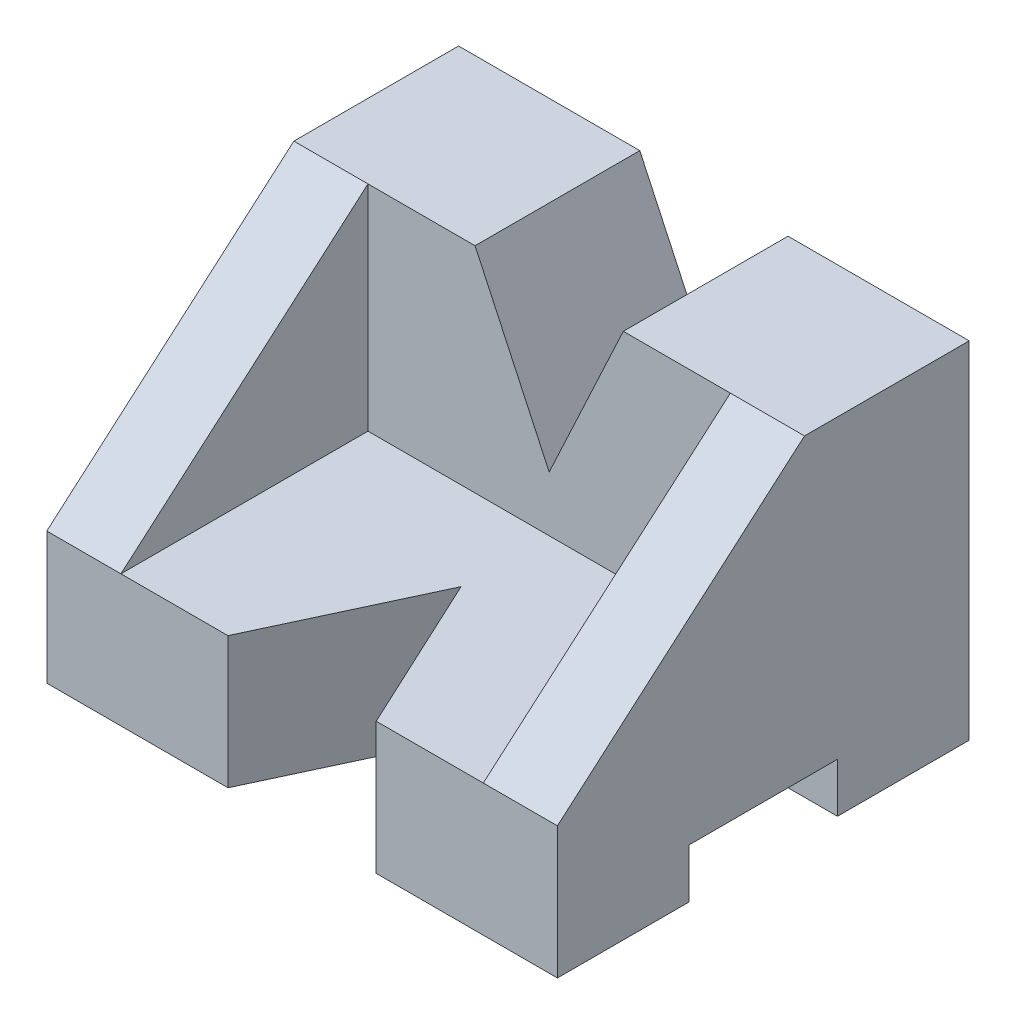
ISO-10303-21;
HEADER;
FILE_DESCRIPTION(('STEP AP214'),'2;1');
FILE_NAME('part.step','',(''),(''),'','','');
FILE_SCHEMA(('AUTOMOTIVE_DESIGN { 1 0 10303 214 1 1 1 1 }'));
ENDSEC;
DATA;
#1=APPLICATION_CONTEXT('core data for automotive mechanical design processes');
#2=APPLICATION_PROTOCOL_DEFINITION('international standard','automotive_design',2000,#1);
#3=PRODUCT_CONTEXT('',#1,'mechanical');
#4=PRODUCT('Part','Part','',(#3));
#5=PRODUCT_RELATED_PRODUCT_CATEGORY('part','',(#4));
#6=PRODUCT_DEFINITION_FORMATION('','',#4);
#7=PRODUCT_DEFINITION_CONTEXT('part definition',#1,'design');
#8=PRODUCT_DEFINITION('design','',#6,#7);
#9=PRODUCT_DEFINITION_SHAPE('','',#8);
#10=(LENGTH_UNIT() NAMED_UNIT(*) SI_UNIT(.MILLI.,.METRE.));
#11=(NAMED_UNIT(*) PLANE_ANGLE_UNIT() SI_UNIT($,.RADIAN.));
#12=(NAMED_UNIT(*) SI_UNIT($,.STERADIAN.) SOLID_ANGLE_UNIT());
#13=UNCERTAINTY_MEASURE_WITH_UNIT(LENGTH_MEASURE(1.E-05),#10,'distance_accuracy_value','');
#14=(GEOMETRIC_REPRESENTATION_CONTEXT(3) GLOBAL_UNCERTAINTY_ASSIGNED_CONTEXT((#13)) GLOBAL_UNIT_ASSIGNED_CONTEXT((#10,
#11,#12)) REPRESENTATION_CONTEXT('',''));
#15=CARTESIAN_POINT('',(0.,0.,0.));
#16=DIRECTION('',(0.,0.,1.));
#17=DIRECTION('',(1.,0.,0.));
#18=AXIS2_PLACEMENT_3D('',#15,#16,#17);
#19=CARTESIAN_POINT('',(31.,21.,-5.));
#20=DIRECTION('',(0.,-1.,0.));
#21=DIRECTION('',(0.,0.,-1.));
#22=AXIS2_PLACEMENT_3D('',#19,#20,#21);
#23=PLANE('',#22);
#24=DIRECTION('',(0.,0.,1.));
#25=VECTOR('',#24,1.);
#26=CARTESIAN_POINT('',(-9.,21.,-25.));
#27=LINE('',#26,#25);
#28=CARTESIAN_POINT('',(-9.,21.,-25.));
#29=VERTEX_POINT('',#28);
#30=CARTESIAN_POINT('',(-9.,21.,-5.));
#31=VERTEX_POINT('',#30);
#32=EDGE_CURVE('E52',#29,#31,#27,.T.);
#33=ORIENTED_EDGE('',*,*,#32,.F.);
#34=DIRECTION('',(-1.,0.,0.));
#35=VECTOR('',#34,1.);
#36=CARTESIAN_POINT('',(31.,21.,-25.));
#37=LINE('',#36,#35);
#38=CARTESIAN_POINT('',(-31.,21.,-25.));
#39=VERTEX_POINT('',#38);
#40=EDGE_CURVE('E183',#29,#39,#37,.T.);
#41=ORIENTED_EDGE('',*,*,#40,.T.);
#42=DIRECTION('',(0.,0.,1.));
#43=VECTOR('',#42,1.);
#44=CARTESIAN_POINT('',(-31.,21.,-5.));
#45=LINE('',#44,#43);
#46=CARTESIAN_POINT('',(-31.,21.,-5.));
#47=VERTEX_POINT('',#46);
#48=EDGE_CURVE('E305',#39,#47,#45,.T.);
#49=ORIENTED_EDGE('',*,*,#48,.T.);
#50=DIRECTION('',(1.,0.,0.));
#51=VECTOR('',#50,1.);
#52=CARTESIAN_POINT('',(-31.,21.,-5.));
#53=LINE('',#52,#51);
#54=CARTESIAN_POINT('',(-22.,21.,-5.));
#55=VERTEX_POINT('',#54);
#56=EDGE_CURVE('E274',#47,#55,#53,.T.);
#57=ORIENTED_EDGE('',*,*,#56,.T.);
#58=DIRECTION('',(-1.,0.,0.));
#59=VECTOR('',#58,1.);
#60=CARTESIAN_POINT('',(31.,21.,-5.));
#61=LINE('',#60,#59);
#62=EDGE_CURVE('E187',#31,#55,#61,.T.);
#63=ORIENTED_EDGE('',*,*,#62,.F.);
#64=EDGE_LOOP('',(#33,#41,#49,#57,#63));
#65=FACE_BOUND('',#64,.T.);
#66=ADVANCED_FACE('F36',(#65),#23,.F.);
#67=CARTESIAN_POINT('',(31.,-21.,25.));
#68=DIRECTION('',(0.,0.,-1.));
#69=DIRECTION('',(0.,1.,0.));
#70=AXIS2_PLACEMENT_3D('',#67,#68,#69);
#71=PLANE('',#70);
#72=DIRECTION('',(0.,1.,0.));
#73=VECTOR('',#72,1.);
#74=CARTESIAN_POINT('',(9.,-21.,25.));
#75=LINE('',#74,#73);
#76=CARTESIAN_POINT('',(9.,-21.,25.));
#77=VERTEX_POINT('',#76);
#78=CARTESIAN_POINT('',(9.,-5.00000000000001,25.));
#79=VERTEX_POINT('',#78);
#80=EDGE_CURVE('E251',#77,#79,#75,.T.);
#81=ORIENTED_EDGE('',*,*,#80,.F.);
#82=DIRECTION('',(-1.,0.,0.));
#83=VECTOR('',#82,1.);
#84=CARTESIAN_POINT('',(31.,-21.,25.));
#85=LINE('',#84,#83);
#86=CARTESIAN_POINT('',(31.,-21.,25.));
#87=VERTEX_POINT('',#86);
#88=EDGE_CURVE('E222',#87,#77,#85,.T.);
#89=ORIENTED_EDGE('',*,*,#88,.F.);
#90=DIRECTION('',(0.,-1.,0.));
#91=VECTOR('',#90,1.);
#92=CARTESIAN_POINT('',(31.,-21.,25.));
#93=LINE('',#92,#91);
#94=CARTESIAN_POINT('',(31.,-5.00000000000001,25.));
#95=VERTEX_POINT('',#94);
#96=EDGE_CURVE('E298',#95,#87,#93,.T.);
#97=ORIENTED_EDGE('',*,*,#96,.F.);
#98=DIRECTION('',(-1.,0.,0.));
#99=VECTOR('',#98,1.);
#100=CARTESIAN_POINT('',(31.,-5.00000000000001,25.));
#101=LINE('',#100,#99);
#102=CARTESIAN_POINT('',(22.,-5.00000000000001,25.));
#103=VERTEX_POINT('',#102);
#104=EDGE_CURVE('E223',#95,#103,#101,.T.);
#105=ORIENTED_EDGE('',*,*,#104,.T.);
#106=EDGE_CURVE('E228',#103,#79,#101,.T.);
#107=ORIENTED_EDGE('',*,*,#106,.T.);
#108=EDGE_LOOP('',(#81,#89,#97,#105,#107));
#109=FACE_BOUND('',#108,.T.);
#110=ADVANCED_FACE('F392',(#109),#71,.F.);
#111=CARTESIAN_POINT('',(31.,-21.,9.));
#112=DIRECTION('',(0.,1.,0.));
#113=DIRECTION('',(0.,0.,1.));
#114=AXIS2_PLACEMENT_3D('',#111,#112,#113);
#115=PLANE('',#114);
#116=DIRECTION('',(-1.,0.,0.));
#117=VECTOR('',#116,1.);
#118=CARTESIAN_POINT('',(31.,-21.,9.));
#119=LINE('',#118,#117);
#120=CARTESIAN_POINT('',(-1.53907746951993,-21.,9.));
#121=VERTEX_POINT('',#120);
#122=CARTESIAN_POINT('',(-31.,-21.,9.));
#123=VERTEX_POINT('',#122);
#124=EDGE_CURVE('E216',#121,#123,#119,.T.);
#125=ORIENTED_EDGE('',*,*,#124,.F.);
#126=DIRECTION('',(-0.422618261740704,0.,0.906307787036648));
#127=VECTOR('',#126,1.);
#128=CARTESIAN_POINT('',(-9.,-21.,25.));
#129=LINE('',#128,#127);
#130=CARTESIAN_POINT('',(-9.,-21.,25.));
#131=VERTEX_POINT('',#130);
#132=EDGE_CURVE('E248',#121,#131,#129,.T.);
#133=ORIENTED_EDGE('',*,*,#132,.T.);
#134=CARTESIAN_POINT('',(-31.,-21.,25.));
#135=VERTEX_POINT('',#134);
#136=EDGE_CURVE('E219',#131,#135,#85,.T.);
#137=ORIENTED_EDGE('',*,*,#136,.T.);
#138=DIRECTION('',(0.,0.,-1.));
#139=VECTOR('',#138,1.);
#140=CARTESIAN_POINT('',(-31.,-21.,9.));
#141=LINE('',#140,#139);
#142=EDGE_CURVE('E317',#135,#123,#141,.T.);
#143=ORIENTED_EDGE('',*,*,#142,.T.);
#144=EDGE_LOOP('',(#125,#133,#137,#143));
#145=FACE_BOUND('',#144,.T.);
#146=ADVANCED_FACE('F389',(#145),#115,.F.);
#147=CARTESIAN_POINT('',(31.,-15.,9.));
#148=DIRECTION('',(0.,0.,1.));
#149=DIRECTION('',(1.,0.,0.));
#150=AXIS2_PLACEMENT_3D('',#147,#148,#149);
#151=PLANE('',#150);
#152=DIRECTION('',(-1.,0.,0.));
#153=VECTOR('',#152,1.);
#154=CARTESIAN_POINT('',(31.,-15.,9.));
#155=LINE('',#154,#153);
#156=CARTESIAN_POINT('',(-1.53907746951993,-15.,9.));
#157=VERTEX_POINT('',#156);
#158=CARTESIAN_POINT('',(-31.,-15.,9.));
#159=VERTEX_POINT('',#158);
#160=EDGE_CURVE('E215',#157,#159,#155,.T.);
#161=ORIENTED_EDGE('',*,*,#160,.F.);
#162=DIRECTION('',(0.,-1.,0.));
#163=VECTOR('',#162,1.);
#164=CARTESIAN_POINT('',(-1.53907746951992,-15.,9.));
#165=LINE('',#164,#163);
#166=EDGE_CURVE('E264',#157,#121,#165,.T.);
#167=ORIENTED_EDGE('',*,*,#166,.T.);
#168=ORIENTED_EDGE('',*,*,#124,.T.);
#169=DIRECTION('',(0.,1.,0.));
#170=VECTOR('',#169,1.);
#171=CARTESIAN_POINT('',(-31.,-15.,9.));
#172=LINE('',#171,#170);
#173=EDGE_CURVE('E325',#123,#159,#172,.T.);
#174=ORIENTED_EDGE('',*,*,#173,.T.);
#175=EDGE_LOOP('',(#161,#167,#168,#174));
#176=FACE_BOUND('',#175,.T.);
#177=ADVANCED_FACE('F384',(#176),#151,.F.);
#178=CARTESIAN_POINT('',(31.,-5.00000000000001,-5.));
#179=DIRECTION('',(0.,0.,-1.));
#180=DIRECTION('',(-1.,0.,0.));
#181=AXIS2_PLACEMENT_3D('',#178,#179,#180);
#182=PLANE('',#181);
#183=CARTESIAN_POINT('',(22.,21.,-5.));
#184=VERTEX_POINT('',#183);
#185=CARTESIAN_POINT('',(9.,21.,-5.));
#186=VERTEX_POINT('',#185);
#187=EDGE_CURVE('E203',#184,#186,#61,.T.);
#188=ORIENTED_EDGE('',*,*,#187,.T.);
#189=DIRECTION('',(-0.422618261740704,-0.906307787036648,0.));
#190=VECTOR('',#189,1.);
#191=CARTESIAN_POINT('',(2.97075853290135,8.0702499483839,-5.));
#192=LINE('',#191,#190);
#193=CARTESIAN_POINT('',(0.,1.69943771541422,-5.));
#194=VERTEX_POINT('',#193);
#195=EDGE_CURVE('E11',#186,#194,#192,.T.);
#196=ORIENTED_EDGE('',*,*,#195,.T.);
#197=DIRECTION('',(-0.422618261740704,0.906307787036648,0.));
#198=VECTOR('',#197,1.);
#199=CARTESIAN_POINT('',(8.10282556681618,-15.6771277883046,-5.));
#200=LINE('',#199,#198);
#201=EDGE_CURVE('E46',#194,#31,#200,.T.);
#202=ORIENTED_EDGE('',*,*,#201,.T.);
#203=ORIENTED_EDGE('',*,*,#62,.T.);
#204=DIRECTION('',(0.,1.,0.));
#205=VECTOR('',#204,1.);
#206=CARTESIAN_POINT('',(-22.,-5.00000000000001,-5.));
#207=LINE('',#206,#205);
#208=CARTESIAN_POINT('',(-22.,-5.00000000000001,-5.));
#209=VERTEX_POINT('',#208);
#210=EDGE_CURVE('E271',#209,#55,#207,.T.);
#211=ORIENTED_EDGE('',*,*,#210,.F.);
#212=DIRECTION('',(-1.,0.,0.));
#213=VECTOR('',#212,1.);
#214=CARTESIAN_POINT('',(31.,-5.00000000000001,-5.));
#215=LINE('',#214,#213);
#216=CARTESIAN_POINT('',(22.,-5.00000000000001,-5.));
#217=VERTEX_POINT('',#216);
#218=EDGE_CURVE('E227',#217,#209,#215,.T.);
#219=ORIENTED_EDGE('',*,*,#218,.F.);
#220=DIRECTION('',(0.,1.,0.));
#221=VECTOR('',#220,1.);
#222=CARTESIAN_POINT('',(22.,-5.00000000000001,-5.));
#223=LINE('',#222,#221);
#224=EDGE_CURVE('E290',#217,#184,#223,.T.);
#225=ORIENTED_EDGE('',*,*,#224,.T.);
#226=EDGE_LOOP('',(#188,#196,#202,#203,#211,#219,#225));
#227=FACE_BOUND('',#226,.T.);
#228=ADVANCED_FACE('F37',(#227),#182,.F.);
#229=CARTESIAN_POINT('',(31.,-5.00000000000001,25.));
#230=DIRECTION('',(0.,-1.,0.));
#231=DIRECTION('',(0.,0.,-1.));
#232=AXIS2_PLACEMENT_3D('',#229,#230,#231);
#233=PLANE('',#232);
#234=CARTESIAN_POINT('',(-9.,-5.00000000000001,25.));
#235=VERTEX_POINT('',#234);
#236=CARTESIAN_POINT('',(-22.,-5.00000000000001,25.));
#237=VERTEX_POINT('',#236);
#238=EDGE_CURVE('E221',#235,#237,#101,.T.);
#239=ORIENTED_EDGE('',*,*,#238,.F.);
#240=DIRECTION('',(0.422618261740704,0.,-0.906307787036648));
#241=VECTOR('',#240,1.);
#242=CARTESIAN_POINT('',(-1.85575219373064,-5.00000000000001,9.67911113762032));
#243=LINE('',#242,#241);
#244=CARTESIAN_POINT('',(0.,-5.00000000000001,5.69943771541422));
#245=VERTEX_POINT('',#244);
#246=EDGE_CURVE('E268',#235,#245,#243,.T.);
#247=ORIENTED_EDGE('',*,*,#246,.T.);
#248=DIRECTION('',(0.422618261740704,0.,0.906307787036648));
#249=VECTOR('',#248,1.);
#250=CARTESIAN_POINT('',(12.9293362934482,-5.00000000000001,33.4264888743088));
#251=LINE('',#250,#249);
#252=EDGE_CURVE('E265',#245,#79,#251,.T.);
#253=ORIENTED_EDGE('',*,*,#252,.T.);
#254=ORIENTED_EDGE('',*,*,#106,.F.);
#255=DIRECTION('',(0.,0.,-1.));
#256=VECTOR('',#255,1.);
#257=CARTESIAN_POINT('',(22.,-5.00000000000001,25.));
#258=LINE('',#257,#256);
#259=EDGE_CURVE('E295',#103,#217,#258,.T.);
#260=ORIENTED_EDGE('',*,*,#259,.T.);
#261=ORIENTED_EDGE('',*,*,#218,.T.);
#262=DIRECTION('',(0.,0.,-1.));
#263=VECTOR('',#262,1.);
#264=CARTESIAN_POINT('',(-22.,-5.00000000000001,25.));
#265=LINE('',#264,#263);
#266=EDGE_CURVE('E277',#237,#209,#265,.T.);
#267=ORIENTED_EDGE('',*,*,#266,.F.);
#268=EDGE_LOOP('',(#239,#247,#253,#254,#260,#261,#267));
#269=FACE_BOUND('',#268,.T.);
#270=ADVANCED_FACE('F351',(#269),#233,.F.);
#271=ORIENTED_EDGE('',*,*,#136,.F.);
#272=DIRECTION('',(0.,1.,0.));
#273=VECTOR('',#272,1.);
#274=CARTESIAN_POINT('',(-9.,-21.,25.));
#275=LINE('',#274,#273);
#276=EDGE_CURVE('E255',#131,#235,#275,.T.);
#277=ORIENTED_EDGE('',*,*,#276,.T.);
#278=ORIENTED_EDGE('',*,*,#238,.T.);
#279=DIRECTION('',(1.,0.,0.));
#280=VECTOR('',#279,1.);
#281=CARTESIAN_POINT('',(-31.,-5.00000000000001,25.));
#282=LINE('',#281,#280);
#283=CARTESIAN_POINT('',(-31.,-5.00000000000001,25.));
#284=VERTEX_POINT('',#283);
#285=EDGE_CURVE('E283',#284,#237,#282,.T.);
#286=ORIENTED_EDGE('',*,*,#285,.F.);
#287=DIRECTION('',(0.,-1.,0.));
#288=VECTOR('',#287,1.);
#289=CARTESIAN_POINT('',(-31.,-21.,25.));
#290=LINE('',#289,#288);
#291=EDGE_CURVE('E292',#284,#135,#290,.T.);
#292=ORIENTED_EDGE('',*,*,#291,.T.);
#293=EDGE_LOOP('',(#271,#277,#278,#286,#292));
#294=FACE_BOUND('',#293,.T.);
#295=ADVANCED_FACE('F344',(#294),#71,.F.);
#296=ORIENTED_EDGE('',*,*,#88,.T.);
#297=DIRECTION('',(-0.422618261740704,0.,-0.906307787036648));
#298=VECTOR('',#297,1.);
#299=CARTESIAN_POINT('',(0.,-21.,5.69943771541422));
#300=LINE('',#299,#298);
#301=CARTESIAN_POINT('',(1.53907746951992,-21.,9.));
#302=VERTEX_POINT('',#301);
#303=EDGE_CURVE('E243',#77,#302,#300,.T.);
#304=ORIENTED_EDGE('',*,*,#303,.T.);
#305=CARTESIAN_POINT('',(31.,-21.,9.));
#306=VERTEX_POINT('',#305);
#307=EDGE_CURVE('E220',#306,#302,#119,.T.);
#308=ORIENTED_EDGE('',*,*,#307,.F.);
#309=DIRECTION('',(0.,0.,-1.));
#310=VECTOR('',#309,1.);
#311=CARTESIAN_POINT('',(31.,-21.,9.));
#312=LINE('',#311,#310);
#313=EDGE_CURVE('E302',#87,#306,#312,.T.);
#314=ORIENTED_EDGE('',*,*,#313,.F.);
#315=EDGE_LOOP('',(#296,#304,#308,#314));
#316=FACE_BOUND('',#315,.T.);
#317=ADVANCED_FACE('F402',(#316),#115,.F.);
#318=ORIENTED_EDGE('',*,*,#307,.T.);
#319=DIRECTION('',(0.,1.,0.));
#320=VECTOR('',#319,1.);
#321=CARTESIAN_POINT('',(1.53907746951993,-15.,9.));
#322=LINE('',#321,#320);
#323=CARTESIAN_POINT('',(1.53907746951992,-15.,9.));
#324=VERTEX_POINT('',#323);
#325=EDGE_CURVE('E260',#302,#324,#322,.T.);
#326=ORIENTED_EDGE('',*,*,#325,.T.);
#327=CARTESIAN_POINT('',(31.,-15.,9.));
#328=VERTEX_POINT('',#327);
#329=EDGE_CURVE('E213',#328,#324,#155,.T.);
#330=ORIENTED_EDGE('',*,*,#329,.F.);
#331=DIRECTION('',(0.,1.,0.));
#332=VECTOR('',#331,1.);
#333=CARTESIAN_POINT('',(31.,-15.,9.));
#334=LINE('',#333,#332);
#335=EDGE_CURVE('E301',#306,#328,#334,.T.);
#336=ORIENTED_EDGE('',*,*,#335,.F.);
#337=EDGE_LOOP('',(#318,#326,#330,#336));
#338=FACE_BOUND('',#337,.T.);
#339=ADVANCED_FACE('F401',(#338),#151,.F.);
#340=CARTESIAN_POINT('',(31.,-15.,-9.));
#341=DIRECTION('',(0.,1.,0.));
#342=DIRECTION('',(0.,0.,1.));
#343=AXIS2_PLACEMENT_3D('',#340,#341,#342);
#344=PLANE('',#343);
#345=DIRECTION('',(-0.422618261740704,0.,-0.906307787036648));
#346=VECTOR('',#345,1.);
#347=CARTESIAN_POINT('',(-0.0934192395745867,-15.,5.49909950963779));
#348=LINE('',#347,#346);
#349=CARTESIAN_POINT('',(0.,-15.,5.69943771541422));
#350=VERTEX_POINT('',#349);
#351=EDGE_CURVE('E232',#324,#350,#348,.T.);
#352=ORIENTED_EDGE('',*,*,#351,.T.);
#353=DIRECTION('',(-0.422618261740704,0.,0.906307787036648));
#354=VECTOR('',#353,1.);
#355=CARTESIAN_POINT('',(11.1670033392921,-15.,-18.2482782270507));
#356=LINE('',#355,#354);
#357=EDGE_CURVE('E231',#350,#157,#356,.T.);
#358=ORIENTED_EDGE('',*,*,#357,.T.);
#359=ORIENTED_EDGE('',*,*,#160,.T.);
#360=DIRECTION('',(0.,0.,-1.));
#361=VECTOR('',#360,1.);
#362=CARTESIAN_POINT('',(-31.,-15.,-9.));
#363=LINE('',#362,#361);
#364=CARTESIAN_POINT('',(-31.,-15.,-9.));
#365=VERTEX_POINT('',#364);
#366=EDGE_CURVE('E324',#159,#365,#363,.T.);
#367=ORIENTED_EDGE('',*,*,#366,.T.);
#368=DIRECTION('',(-1.,0.,0.));
#369=VECTOR('',#368,1.);
#370=CARTESIAN_POINT('',(31.,-15.,-9.));
#371=LINE('',#370,#369);
#372=CARTESIAN_POINT('',(31.,-15.,-9.));
#373=VERTEX_POINT('',#372);
#374=EDGE_CURVE('E207',#373,#365,#371,.T.);
#375=ORIENTED_EDGE('',*,*,#374,.F.);
#376=DIRECTION('',(0.,0.,-1.));
#377=VECTOR('',#376,1.);
#378=CARTESIAN_POINT('',(31.,-15.,-9.));
#379=LINE('',#378,#377);
#380=EDGE_CURVE('E308',#328,#373,#379,.T.);
#381=ORIENTED_EDGE('',*,*,#380,.F.);
#382=ORIENTED_EDGE('',*,*,#329,.T.);
#383=EDGE_LOOP('',(#352,#358,#359,#367,#375,#381,#382));
#384=FACE_BOUND('',#383,.T.);
#385=ADVANCED_FACE('F385',(#384),#344,.F.);
#386=CARTESIAN_POINT('',(31.,-21.,-9.));
#387=DIRECTION('',(0.,0.,-1.));
#388=DIRECTION('',(-1.,0.,0.));
#389=AXIS2_PLACEMENT_3D('',#386,#387,#388);
#390=PLANE('',#389);
#391=DIRECTION('',(0.,-1.,0.));
#392=VECTOR('',#391,1.);
#393=CARTESIAN_POINT('',(-31.,-21.,-9.));
#394=LINE('',#393,#392);
#395=CARTESIAN_POINT('',(-31.,-21.,-9.));
#396=VERTEX_POINT('',#395);
#397=EDGE_CURVE('E330',#365,#396,#394,.T.);
#398=ORIENTED_EDGE('',*,*,#397,.T.);
#399=DIRECTION('',(-1.,0.,0.));
#400=VECTOR('',#399,1.);
#401=CARTESIAN_POINT('',(31.,-21.,-9.));
#402=LINE('',#401,#400);
#403=CARTESIAN_POINT('',(31.,-21.,-9.));
#404=VERTEX_POINT('',#403);
#405=EDGE_CURVE('E206',#404,#396,#402,.T.);
#406=ORIENTED_EDGE('',*,*,#405,.F.);
#407=DIRECTION('',(0.,-1.,0.));
#408=VECTOR('',#407,1.);
#409=CARTESIAN_POINT('',(31.,-21.,-9.));
#410=LINE('',#409,#408);
#411=EDGE_CURVE('E306',#373,#404,#410,.T.);
#412=ORIENTED_EDGE('',*,*,#411,.F.);
#413=ORIENTED_EDGE('',*,*,#374,.T.);
#414=EDGE_LOOP('',(#398,#406,#412,#413));
#415=FACE_BOUND('',#414,.T.);
#416=ADVANCED_FACE('F378',(#415),#390,.F.);
#417=CARTESIAN_POINT('',(31.,-21.,-25.));
#418=DIRECTION('',(0.,1.,0.));
#419=DIRECTION('',(0.,0.,1.));
#420=AXIS2_PLACEMENT_3D('',#417,#418,#419);
#421=PLANE('',#420);
#422=DIRECTION('',(0.,0.,-1.));
#423=VECTOR('',#422,1.);
#424=CARTESIAN_POINT('',(-31.,-21.,-25.));
#425=LINE('',#424,#423);
#426=CARTESIAN_POINT('',(-31.,-21.,-25.));
#427=VERTEX_POINT('',#426);
#428=EDGE_CURVE('E328',#396,#427,#425,.T.);
#429=ORIENTED_EDGE('',*,*,#428,.T.);
#430=DIRECTION('',(-1.,0.,0.));
#431=VECTOR('',#430,1.);
#432=CARTESIAN_POINT('',(31.,-21.,-25.));
#433=LINE('',#432,#431);
#434=CARTESIAN_POINT('',(31.,-21.,-25.));
#435=VERTEX_POINT('',#434);
#436=EDGE_CURVE('E200',#435,#427,#433,.T.);
#437=ORIENTED_EDGE('',*,*,#436,.F.);
#438=DIRECTION('',(0.,0.,-1.));
#439=VECTOR('',#438,1.);
#440=CARTESIAN_POINT('',(31.,-21.,-25.));
#441=LINE('',#440,#439);
#442=EDGE_CURVE('E309',#404,#435,#441,.T.);
#443=ORIENTED_EDGE('',*,*,#442,.F.);
#444=ORIENTED_EDGE('',*,*,#405,.T.);
#445=EDGE_LOOP('',(#429,#437,#443,#444));
#446=FACE_BOUND('',#445,.T.);
#447=ADVANCED_FACE('F373',(#446),#421,.F.);
#448=CARTESIAN_POINT('',(31.,21.,-25.));
#449=DIRECTION('',(0.,0.,1.));
#450=DIRECTION('',(0.,-1.,0.));
#451=AXIS2_PLACEMENT_3D('',#448,#449,#450);
#452=PLANE('',#451);
#453=DIRECTION('',(0.422618261740704,-0.906307787036648,0.));
#454=VECTOR('',#453,1.);
#455=CARTESIAN_POINT('',(-9.,21.,-25.));
#456=LINE('',#455,#454);
#457=CARTESIAN_POINT('',(0.,1.69943771541422,-25.));
#458=VERTEX_POINT('',#457);
#459=EDGE_CURVE('E172',#29,#458,#456,.T.);
#460=ORIENTED_EDGE('',*,*,#459,.T.);
#461=DIRECTION('',(0.422618261740704,0.906307787036648,0.));
#462=VECTOR('',#461,1.);
#463=CARTESIAN_POINT('',(0.,1.69943771541422,-25.));
#464=LINE('',#463,#462);
#465=CARTESIAN_POINT('',(9.,21.,-25.));
#466=VERTEX_POINT('',#465);
#467=EDGE_CURVE('E182',#458,#466,#464,.T.);
#468=ORIENTED_EDGE('',*,*,#467,.T.);
#469=CARTESIAN_POINT('',(31.,21.,-25.));
#470=VERTEX_POINT('',#469);
#471=EDGE_CURVE('E193',#470,#466,#37,.T.);
#472=ORIENTED_EDGE('',*,*,#471,.F.);
#473=DIRECTION('',(0.,1.,0.));
#474=VECTOR('',#473,1.);
#475=CARTESIAN_POINT('',(31.,21.,-25.));
#476=LINE('',#475,#474);
#477=EDGE_CURVE('E315',#435,#470,#476,.T.);
#478=ORIENTED_EDGE('',*,*,#477,.F.);
#479=ORIENTED_EDGE('',*,*,#436,.T.);
#480=DIRECTION('',(0.,1.,0.));
#481=VECTOR('',#480,1.);
#482=CARTESIAN_POINT('',(-31.,21.,-25.));
#483=LINE('',#482,#481);
#484=EDGE_CURVE('E194',#427,#39,#483,.T.);
#485=ORIENTED_EDGE('',*,*,#484,.T.);
#486=ORIENTED_EDGE('',*,*,#40,.F.);
#487=EDGE_LOOP('',(#460,#468,#472,#478,#479,#485,#486));
#488=FACE_BOUND('',#487,.T.);
#489=ADVANCED_FACE('F189',(#488),#452,.F.);
#490=ORIENTED_EDGE('',*,*,#471,.T.);
#491=DIRECTION('',(0.,0.,1.));
#492=VECTOR('',#491,1.);
#493=CARTESIAN_POINT('',(9.,21.,-25.));
#494=LINE('',#493,#492);
#495=EDGE_CURVE('E245',#466,#186,#494,.T.);
#496=ORIENTED_EDGE('',*,*,#495,.T.);
#497=ORIENTED_EDGE('',*,*,#187,.F.);
#498=CARTESIAN_POINT('',(31.,21.,-5.));
#499=VERTEX_POINT('',#498);
#500=EDGE_CURVE('E198',#499,#184,#61,.T.);
#501=ORIENTED_EDGE('',*,*,#500,.F.);
#502=DIRECTION('',(0.,0.,1.));
#503=VECTOR('',#502,1.);
#504=CARTESIAN_POINT('',(31.,21.,-5.));
#505=LINE('',#504,#503);
#506=EDGE_CURVE('E314',#470,#499,#505,.T.);
#507=ORIENTED_EDGE('',*,*,#506,.F.);
#508=EDGE_LOOP('',(#490,#496,#497,#501,#507));
#509=FACE_BOUND('',#508,.T.);
#510=ADVANCED_FACE('F361',(#509),#23,.F.);
#511=CARTESIAN_POINT('',(31.,0.,0.));
#512=DIRECTION('',(-1.,0.,0.));
#513=DIRECTION('',(0.,0.,1.));
#514=AXIS2_PLACEMENT_3D('',#511,#512,#513);
#515=PLANE('',#514);
#516=ORIENTED_EDGE('',*,*,#506,.T.);
#517=DIRECTION('',(0.,-0.654930538417842,0.755689082789817));
#518=VECTOR('',#517,1.);
#519=CARTESIAN_POINT('',(31.,21.,-5.));
#520=LINE('',#519,#518);
#521=EDGE_CURVE('E286',#499,#95,#520,.T.);
#522=ORIENTED_EDGE('',*,*,#521,.T.);
#523=ORIENTED_EDGE('',*,*,#96,.T.);
#524=ORIENTED_EDGE('',*,*,#313,.T.);
#525=ORIENTED_EDGE('',*,*,#335,.T.);
#526=ORIENTED_EDGE('',*,*,#380,.T.);
#527=ORIENTED_EDGE('',*,*,#411,.T.);
#528=ORIENTED_EDGE('',*,*,#442,.T.);
#529=ORIENTED_EDGE('',*,*,#477,.T.);
#530=EDGE_LOOP('',(#516,#522,#523,#524,#525,#526,#527,#528,#529));
#531=FACE_BOUND('',#530,.T.);
#532=ADVANCED_FACE('F366',(#531),#515,.F.);
#533=CARTESIAN_POINT('',(-31.,0.,0.));
#534=DIRECTION('',(-1.,0.,0.));
#535=DIRECTION('',(0.,0.,1.));
#536=AXIS2_PLACEMENT_3D('',#533,#534,#535);
#537=PLANE('',#536);
#538=DIRECTION('',(0.,-0.654930538417842,0.755689082789817));
#539=VECTOR('',#538,1.);
#540=CARTESIAN_POINT('',(-31.,21.,-5.));
#541=LINE('',#540,#539);
#542=EDGE_CURVE('E275',#47,#284,#541,.T.);
#543=ORIENTED_EDGE('',*,*,#542,.F.);
#544=ORIENTED_EDGE('',*,*,#48,.F.);
#545=ORIENTED_EDGE('',*,*,#484,.F.);
#546=ORIENTED_EDGE('',*,*,#428,.F.);
#547=ORIENTED_EDGE('',*,*,#397,.F.);
#548=ORIENTED_EDGE('',*,*,#366,.F.);
#549=ORIENTED_EDGE('',*,*,#173,.F.);
#550=ORIENTED_EDGE('',*,*,#142,.F.);
#551=ORIENTED_EDGE('',*,*,#291,.F.);
#552=EDGE_LOOP('',(#543,#544,#545,#546,#547,#548,#549,#550,#551));
#553=FACE_BOUND('',#552,.T.);
#554=ADVANCED_FACE('F337',(#553),#537,.T.);
#555=CARTESIAN_POINT('',(31.,21.,-5.));
#556=DIRECTION('',(0.,-0.755689082789817,-0.654930538417842));
#557=DIRECTION('',(0.,0.654930538417842,-0.755689082789818));
#558=AXIS2_PLACEMENT_3D('',#555,#556,#557);
#559=PLANE('',#558);
#560=DIRECTION('',(0.,-0.654930538417842,0.755689082789817));
#561=VECTOR('',#560,1.);
#562=CARTESIAN_POINT('',(22.,21.,-5.));
#563=LINE('',#562,#561);
#564=EDGE_CURVE('E293',#184,#103,#563,.T.);
#565=ORIENTED_EDGE('',*,*,#564,.T.);
#566=ORIENTED_EDGE('',*,*,#104,.F.);
#567=ORIENTED_EDGE('',*,*,#521,.F.);
#568=ORIENTED_EDGE('',*,*,#500,.T.);
#569=EDGE_LOOP('',(#565,#566,#567,#568));
#570=FACE_BOUND('',#569,.T.);
#571=ADVANCED_FACE('F358',(#570),#559,.F.);
#572=CARTESIAN_POINT('',(22.,0.,0.));
#573=DIRECTION('',(-1.,0.,0.));
#574=DIRECTION('',(0.,0.,1.));
#575=AXIS2_PLACEMENT_3D('',#572,#573,#574);
#576=PLANE('',#575);
#577=ORIENTED_EDGE('',*,*,#224,.F.);
#578=ORIENTED_EDGE('',*,*,#259,.F.);
#579=ORIENTED_EDGE('',*,*,#564,.F.);
#580=EDGE_LOOP('',(#577,#578,#579));
#581=FACE_BOUND('',#580,.T.);
#582=ADVANCED_FACE('F357',(#581),#576,.T.);
#583=CARTESIAN_POINT('',(-31.,21.,-5.));
#584=DIRECTION('',(0.,0.755689082789817,0.654930538417842));
#585=DIRECTION('',(0.,-0.654930538417842,0.755689082789818));
#586=AXIS2_PLACEMENT_3D('',#583,#584,#585);
#587=PLANE('',#586);
#588=DIRECTION('',(0.,-0.654930538417842,0.755689082789817));
#589=VECTOR('',#588,1.);
#590=CARTESIAN_POINT('',(-22.,21.,-5.));
#591=LINE('',#590,#589);
#592=EDGE_CURVE('E276',#55,#237,#591,.T.);
#593=ORIENTED_EDGE('',*,*,#592,.F.);
#594=ORIENTED_EDGE('',*,*,#56,.F.);
#595=ORIENTED_EDGE('',*,*,#542,.T.);
#596=ORIENTED_EDGE('',*,*,#285,.T.);
#597=EDGE_LOOP('',(#593,#594,#595,#596));
#598=FACE_BOUND('',#597,.T.);
#599=ADVANCED_FACE('F336',(#598),#587,.T.);
#600=CARTESIAN_POINT('',(-22.,0.,0.));
#601=DIRECTION('',(-1.,0.,0.));
#602=DIRECTION('',(0.,0.,1.));
#603=AXIS2_PLACEMENT_3D('',#600,#601,#602);
#604=PLANE('',#603);
#605=ORIENTED_EDGE('',*,*,#210,.T.);
#606=ORIENTED_EDGE('',*,*,#592,.T.);
#607=ORIENTED_EDGE('',*,*,#266,.T.);
#608=EDGE_LOOP('',(#605,#606,#607));
#609=FACE_BOUND('',#608,.T.);
#610=ADVANCED_FACE('F350',(#609),#604,.F.);
#611=CARTESIAN_POINT('',(-9.,-21.,25.));
#612=DIRECTION('',(-0.906307787036648,0.,-0.422618261740704));
#613=DIRECTION('',(-0.422618261740704,0.,0.906307787036648));
#614=AXIS2_PLACEMENT_3D('',#611,#612,#613);
#615=PLANE('',#614);
#616=ORIENTED_EDGE('',*,*,#276,.F.);
#617=ORIENTED_EDGE('',*,*,#132,.F.);
#618=ORIENTED_EDGE('',*,*,#166,.F.);
#619=ORIENTED_EDGE('',*,*,#357,.F.);
#620=DIRECTION('',(0.,1.,0.));
#621=VECTOR('',#620,1.);
#622=CARTESIAN_POINT('',(0.,-21.,5.69943771541422));
#623=LINE('',#622,#621);
#624=EDGE_CURVE('E61',#350,#245,#623,.T.);
#625=ORIENTED_EDGE('',*,*,#624,.T.);
#626=ORIENTED_EDGE('',*,*,#246,.F.);
#627=EDGE_LOOP('',(#616,#617,#618,#619,#625,#626));
#628=FACE_BOUND('',#627,.T.);
#629=ADVANCED_FACE('F388',(#628),#615,.F.);
#630=CARTESIAN_POINT('',(0.,-21.,5.69943771541422));
#631=DIRECTION('',(0.906307787036648,0.,-0.422618261740704));
#632=DIRECTION('',(-0.422618261740704,0.,-0.906307787036648));
#633=AXIS2_PLACEMENT_3D('',#630,#631,#632);
#634=PLANE('',#633);
#635=ORIENTED_EDGE('',*,*,#624,.F.);
#636=ORIENTED_EDGE('',*,*,#351,.F.);
#637=ORIENTED_EDGE('',*,*,#325,.F.);
#638=ORIENTED_EDGE('',*,*,#303,.F.);
#639=ORIENTED_EDGE('',*,*,#80,.T.);
#640=ORIENTED_EDGE('',*,*,#252,.F.);
#641=EDGE_LOOP('',(#635,#636,#637,#638,#639,#640));
#642=FACE_BOUND('',#641,.T.);
#643=ADVANCED_FACE('F404',(#642),#634,.F.);
#644=CARTESIAN_POINT('',(0.,1.69943771541422,-25.));
#645=DIRECTION('',(0.906307787036648,-0.422618261740704,0.));
#646=DIRECTION('',(0.422618261740704,0.906307787036648,0.));
#647=AXIS2_PLACEMENT_3D('',#644,#645,#646);
#648=PLANE('',#647);
#649=ORIENTED_EDGE('',*,*,#495,.F.);
#650=ORIENTED_EDGE('',*,*,#467,.F.);
#651=DIRECTION('',(0.,0.,1.));
#652=VECTOR('',#651,1.);
#653=CARTESIAN_POINT('',(0.,1.69943771541422,-25.));
#654=LINE('',#653,#652);
#655=EDGE_CURVE('E177',#458,#194,#654,.T.);
#656=ORIENTED_EDGE('',*,*,#655,.T.);
#657=ORIENTED_EDGE('',*,*,#195,.F.);
#658=EDGE_LOOP('',(#649,#650,#656,#657));
#659=FACE_BOUND('',#658,.T.);
#660=ADVANCED_FACE('F238',(#659),#648,.F.);
#661=CARTESIAN_POINT('',(-9.,21.,-25.));
#662=DIRECTION('',(-0.906307787036648,-0.422618261740704,0.));
#663=DIRECTION('',(0.422618261740704,-0.906307787036648,0.));
#664=AXIS2_PLACEMENT_3D('',#661,#662,#663);
#665=PLANE('',#664);
#666=ORIENTED_EDGE('',*,*,#655,.F.);
#667=ORIENTED_EDGE('',*,*,#459,.F.);
#668=ORIENTED_EDGE('',*,*,#32,.T.);
#669=ORIENTED_EDGE('',*,*,#201,.F.);
#670=EDGE_LOOP('',(#666,#667,#668,#669));
#671=FACE_BOUND('',#670,.T.);
#672=ADVANCED_FACE('F173',(#671),#665,.F.);
#673=CLOSED_SHELL('',(#66,#110,#146,#177,#228,#270,#295,#317,#339,#385,#416,#447,#489,#510,#532,
#554,#571,#582,#599,#610,#629,#643,#660,#672));
#674=MANIFOLD_SOLID_BREP('B2',#673);
#675=ADVANCED_BREP_SHAPE_REPRESENTATION('',(#18,#674),#14);
#676=SHAPE_DEFINITION_REPRESENTATION(#9,#675);
ENDSEC;
END-ISO-10303-21;
